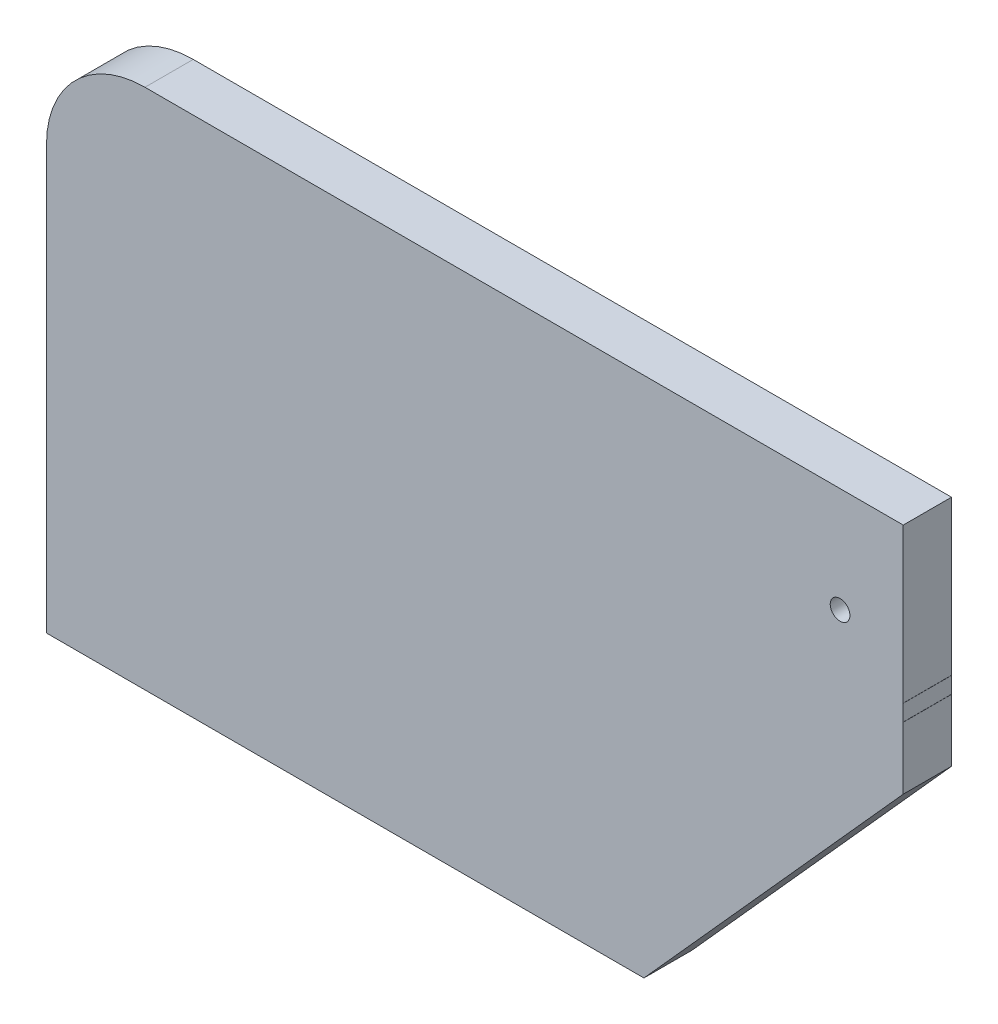
ISO-10303-21;
HEADER;
FILE_DESCRIPTION(('STEP AP214'),'2;1');
FILE_NAME('part.step','',(''),(''),'','','');
FILE_SCHEMA(('AUTOMOTIVE_DESIGN { 1 0 10303 214 1 1 1 1 }'));
ENDSEC;
DATA;
#1=APPLICATION_CONTEXT('core data for automotive mechanical design processes');
#2=APPLICATION_PROTOCOL_DEFINITION('international standard','automotive_design',2000,#1);
#3=PRODUCT_CONTEXT('',#1,'mechanical');
#4=PRODUCT('Part','Part','',(#3));
#5=PRODUCT_RELATED_PRODUCT_CATEGORY('part','',(#4));
#6=PRODUCT_DEFINITION_FORMATION('','',#4);
#7=PRODUCT_DEFINITION_CONTEXT('part definition',#1,'design');
#8=PRODUCT_DEFINITION('design','',#6,#7);
#9=PRODUCT_DEFINITION_SHAPE('','',#8);
#10=(LENGTH_UNIT() NAMED_UNIT(*) SI_UNIT(.MILLI.,.METRE.));
#11=(NAMED_UNIT(*) PLANE_ANGLE_UNIT() SI_UNIT($,.RADIAN.));
#12=(NAMED_UNIT(*) SI_UNIT($,.STERADIAN.) SOLID_ANGLE_UNIT());
#13=UNCERTAINTY_MEASURE_WITH_UNIT(LENGTH_MEASURE(1.E-05),#10,'distance_accuracy_value','');
#14=(GEOMETRIC_REPRESENTATION_CONTEXT(3) GLOBAL_UNCERTAINTY_ASSIGNED_CONTEXT((#13)) GLOBAL_UNIT_ASSIGNED_CONTEXT((#10,
#11,#12)) REPRESENTATION_CONTEXT('',''));
#15=CARTESIAN_POINT('',(0.,0.,0.));
#16=DIRECTION('',(0.,0.,1.));
#17=DIRECTION('',(1.,0.,0.));
#18=AXIS2_PLACEMENT_3D('',#15,#16,#17);
#19=CARTESIAN_POINT('',(17.69985,13.4,1.47));
#20=DIRECTION('',(0.,0.,-1.));
#21=DIRECTION('',(-1.,0.,0.));
#22=AXIS2_PLACEMENT_3D('',#19,#20,#21);
#23=CYLINDRICAL_SURFACE('',#22,0.000150000000000844);
#24=CARTESIAN_POINT('',(17.69985,13.4,0.));
#25=DIRECTION('',(0.,0.,1.));
#26=DIRECTION('',(1.,0.,0.));
#27=AXIS2_PLACEMENT_3D('',#24,#25,#26);
#28=CIRCLE('',#27,0.000150000000000844);
#29=CARTESIAN_POINT('',(17.7,13.4,0.));
#30=VERTEX_POINT('',#29);
#31=CARTESIAN_POINT('',(17.6997,13.4,0.));
#32=VERTEX_POINT('',#31);
#33=EDGE_CURVE('E164',#30,#32,#28,.T.);
#34=ORIENTED_EDGE('',*,*,#33,.F.);
#35=DIRECTION('',(0.,0.,-1.));
#36=VECTOR('',#35,1.);
#37=CARTESIAN_POINT('',(17.7,13.4,1.47));
#38=LINE('',#37,#36);
#39=CARTESIAN_POINT('',(17.7,13.4,1.47));
#40=VERTEX_POINT('',#39);
#41=EDGE_CURVE('E11',#40,#30,#38,.T.);
#42=ORIENTED_EDGE('',*,*,#41,.F.);
#43=CARTESIAN_POINT('',(17.69985,13.4,1.47));
#44=DIRECTION('',(0.,0.,1.));
#45=DIRECTION('',(1.,0.,0.));
#46=AXIS2_PLACEMENT_3D('',#43,#44,#45);
#47=CIRCLE('',#46,0.000150000000000844);
#48=CARTESIAN_POINT('',(17.6997,13.4,1.47));
#49=VERTEX_POINT('',#48);
#50=EDGE_CURVE('E202',#40,#49,#47,.T.);
#51=ORIENTED_EDGE('',*,*,#50,.T.);
#52=DIRECTION('',(0.,0.,-1.));
#53=VECTOR('',#52,1.);
#54=CARTESIAN_POINT('',(17.6997,13.4,1.47));
#55=LINE('',#54,#53);
#56=EDGE_CURVE('E48',#49,#32,#55,.T.);
#57=ORIENTED_EDGE('',*,*,#56,.T.);
#58=EDGE_LOOP('',(#34,#42,#51,#57));
#59=FACE_BOUND('',#58,.T.);
#60=ADVANCED_FACE('F32',(#59),#23,.F.);
#61=CARTESIAN_POINT('',(0.,13.4,1.47));
#62=DIRECTION('',(0.,-1.,0.));
#63=DIRECTION('',(0.,0.,-1.));
#64=AXIS2_PLACEMENT_3D('',#61,#62,#63);
#65=PLANE('',#64);
#66=DIRECTION('',(-1.,0.,0.));
#67=VECTOR('',#66,1.);
#68=CARTESIAN_POINT('',(0.,13.4,0.));
#69=LINE('',#68,#67);
#70=CARTESIAN_POINT('',(18.1997,13.4,0.));
#71=VERTEX_POINT('',#70);
#72=EDGE_CURVE('E166',#71,#30,#69,.T.);
#73=ORIENTED_EDGE('',*,*,#72,.F.);
#74=DIRECTION('',(0.,0.,-1.));
#75=VECTOR('',#74,1.);
#76=CARTESIAN_POINT('',(18.1997,13.4,1.47));
#77=LINE('',#76,#75);
#78=CARTESIAN_POINT('',(18.1997,13.4,1.47));
#79=VERTEX_POINT('',#78);
#80=EDGE_CURVE('E40',#79,#71,#77,.T.);
#81=ORIENTED_EDGE('',*,*,#80,.F.);
#82=DIRECTION('',(-1.,0.,0.));
#83=VECTOR('',#82,1.);
#84=CARTESIAN_POINT('',(0.,13.4,1.47));
#85=LINE('',#84,#83);
#86=EDGE_CURVE('E245',#79,#40,#85,.T.);
#87=ORIENTED_EDGE('',*,*,#86,.T.);
#88=ORIENTED_EDGE('',*,*,#41,.T.);
#89=EDGE_LOOP('',(#73,#81,#87,#88));
#90=FACE_BOUND('',#89,.T.);
#91=ADVANCED_FACE('F232',(#90),#65,.T.);
#92=CARTESIAN_POINT('',(18.19985,13.4,1.47));
#93=DIRECTION('',(0.,0.,-1.));
#94=DIRECTION('',(-1.,0.,0.));
#95=AXIS2_PLACEMENT_3D('',#92,#93,#94);
#96=CYLINDRICAL_SURFACE('',#95,0.000150000000000844);
#97=CARTESIAN_POINT('',(18.19985,13.4,0.));
#98=DIRECTION('',(0.,0.,1.));
#99=DIRECTION('',(1.,0.,0.));
#100=AXIS2_PLACEMENT_3D('',#97,#98,#99);
#101=CIRCLE('',#100,0.000150000000000844);
#102=CARTESIAN_POINT('',(18.2,13.4,0.));
#103=VERTEX_POINT('',#102);
#104=EDGE_CURVE('E169',#103,#71,#101,.T.);
#105=ORIENTED_EDGE('',*,*,#104,.F.);
#106=DIRECTION('',(0.,0.,-1.));
#107=VECTOR('',#106,1.);
#108=CARTESIAN_POINT('',(18.2,13.4,1.47));
#109=LINE('',#108,#107);
#110=CARTESIAN_POINT('',(18.2,13.4,1.47));
#111=VERTEX_POINT('',#110);
#112=EDGE_CURVE('E221',#111,#103,#109,.T.);
#113=ORIENTED_EDGE('',*,*,#112,.F.);
#114=CARTESIAN_POINT('',(18.19985,13.4,1.47));
#115=DIRECTION('',(0.,0.,1.));
#116=DIRECTION('',(1.,0.,0.));
#117=AXIS2_PLACEMENT_3D('',#114,#115,#116);
#118=CIRCLE('',#117,0.000150000000000844);
#119=EDGE_CURVE('E228',#111,#79,#118,.T.);
#120=ORIENTED_EDGE('',*,*,#119,.T.);
#121=ORIENTED_EDGE('',*,*,#80,.T.);
#122=EDGE_LOOP('',(#105,#113,#120,#121));
#123=FACE_BOUND('',#122,.T.);
#124=ADVANCED_FACE('F226',(#123),#96,.F.);
#125=CARTESIAN_POINT('',(0.,13.4,1.47));
#126=DIRECTION('',(0.,-1.,0.));
#127=DIRECTION('',(0.,0.,-1.));
#128=AXIS2_PLACEMENT_3D('',#125,#126,#127);
#129=PLANE('',#128);
#130=DIRECTION('',(-1.,0.,0.));
#131=VECTOR('',#130,1.);
#132=CARTESIAN_POINT('',(0.,13.4,0.));
#133=LINE('',#132,#131);
#134=CARTESIAN_POINT('',(18.5,13.4,0.));
#135=VERTEX_POINT('',#134);
#136=EDGE_CURVE('E172',#135,#103,#133,.T.);
#137=ORIENTED_EDGE('',*,*,#136,.F.);
#138=DIRECTION('',(0.,0.,-1.));
#139=VECTOR('',#138,1.);
#140=CARTESIAN_POINT('',(18.5,13.4,1.47));
#141=LINE('',#140,#139);
#142=CARTESIAN_POINT('',(18.5,13.4,1.47));
#143=VERTEX_POINT('',#142);
#144=EDGE_CURVE('E219',#143,#135,#141,.T.);
#145=ORIENTED_EDGE('',*,*,#144,.F.);
#146=DIRECTION('',(-1.,0.,0.));
#147=VECTOR('',#146,1.);
#148=CARTESIAN_POINT('',(0.,13.4,1.47));
#149=LINE('',#148,#147);
#150=EDGE_CURVE('E244',#143,#111,#149,.T.);
#151=ORIENTED_EDGE('',*,*,#150,.T.);
#152=ORIENTED_EDGE('',*,*,#112,.T.);
#153=EDGE_LOOP('',(#137,#145,#151,#152));
#154=FACE_BOUND('',#153,.T.);
#155=ADVANCED_FACE('F240',(#154),#129,.T.);
#156=CARTESIAN_POINT('',(3.58292456203075,-3.21648909545942,1.47));
#157=DIRECTION('',(-0.744134494477024,0.668029830269146,0.));
#158=DIRECTION('',(-0.668029830269146,-0.744134494477024,0.));
#159=AXIS2_PLACEMENT_3D('',#156,#157,#158);
#160=PLANE('',#159);
#161=DIRECTION('',(0.668029830269146,0.744134494477024,0.));
#162=VECTOR('',#161,1.);
#163=CARTESIAN_POINT('',(3.58292456203075,-3.21648909545942,0.));
#164=LINE('',#163,#162);
#165=CARTESIAN_POINT('',(26.4,22.2,0.));
#166=VERTEX_POINT('',#165);
#167=EDGE_CURVE('E175',#135,#166,#164,.T.);
#168=ORIENTED_EDGE('',*,*,#167,.T.);
#169=DIRECTION('',(0.,0.,-1.));
#170=VECTOR('',#169,1.);
#171=CARTESIAN_POINT('',(26.4,22.2,1.47));
#172=LINE('',#171,#170);
#173=CARTESIAN_POINT('',(26.4,22.2,1.47));
#174=VERTEX_POINT('',#173);
#175=EDGE_CURVE('E216',#174,#166,#172,.T.);
#176=ORIENTED_EDGE('',*,*,#175,.F.);
#177=DIRECTION('',(0.668029830269146,0.744134494477024,0.));
#178=VECTOR('',#177,1.);
#179=CARTESIAN_POINT('',(3.58292456203075,-3.21648909545942,1.47));
#180=LINE('',#179,#178);
#181=EDGE_CURVE('E247',#143,#174,#180,.T.);
#182=ORIENTED_EDGE('',*,*,#181,.F.);
#183=ORIENTED_EDGE('',*,*,#144,.T.);
#184=EDGE_LOOP('',(#168,#176,#182,#183));
#185=FACE_BOUND('',#184,.T.);
#186=ADVANCED_FACE('F296',(#185),#160,.F.);
#187=CARTESIAN_POINT('',(26.4,0.,1.47));
#188=DIRECTION('',(-1.,0.,0.));
#189=DIRECTION('',(0.,0.,1.));
#190=AXIS2_PLACEMENT_3D('',#187,#188,#189);
#191=PLANE('',#190);
#192=DIRECTION('',(0.,1.,0.));
#193=VECTOR('',#192,1.);
#194=CARTESIAN_POINT('',(26.4,0.,0.));
#195=LINE('',#194,#193);
#196=CARTESIAN_POINT('',(26.4,24.0975,0.));
#197=VERTEX_POINT('',#196);
#198=EDGE_CURVE('E177',#166,#197,#195,.T.);
#199=ORIENTED_EDGE('',*,*,#198,.T.);
#200=DIRECTION('',(0.,0.,-1.));
#201=VECTOR('',#200,1.);
#202=CARTESIAN_POINT('',(26.4,24.0975,1.47));
#203=LINE('',#202,#201);
#204=CARTESIAN_POINT('',(26.4,24.0975,1.47));
#205=VERTEX_POINT('',#204);
#206=EDGE_CURVE('E214',#205,#197,#203,.T.);
#207=ORIENTED_EDGE('',*,*,#206,.F.);
#208=DIRECTION('',(0.,1.,0.));
#209=VECTOR('',#208,1.);
#210=CARTESIAN_POINT('',(26.4,0.,1.47));
#211=LINE('',#210,#209);
#212=EDGE_CURVE('E253',#174,#205,#211,.T.);
#213=ORIENTED_EDGE('',*,*,#212,.F.);
#214=ORIENTED_EDGE('',*,*,#175,.T.);
#215=EDGE_LOOP('',(#199,#207,#213,#214));
#216=FACE_BOUND('',#215,.T.);
#217=ADVANCED_FACE('F299',(#216),#191,.F.);
#218=CARTESIAN_POINT('',(26.4,24.1,1.47));
#219=DIRECTION('',(0.,0.,-1.));
#220=DIRECTION('',(-1.,0.,0.));
#221=AXIS2_PLACEMENT_3D('',#218,#219,#220);
#222=CYLINDRICAL_SURFACE('',#221,0.00249999999999903);
#223=CARTESIAN_POINT('',(26.4,24.1,0.));
#224=DIRECTION('',(0.,0.,1.));
#225=DIRECTION('',(1.,0.,0.));
#226=AXIS2_PLACEMENT_3D('',#223,#224,#225);
#227=CIRCLE('',#226,0.00249999999999903);
#228=CARTESIAN_POINT('',(26.4,24.1025,0.));
#229=VERTEX_POINT('',#228);
#230=EDGE_CURVE('E180',#229,#197,#227,.T.);
#231=ORIENTED_EDGE('',*,*,#230,.F.);
#232=DIRECTION('',(0.,0.,-1.));
#233=VECTOR('',#232,1.);
#234=CARTESIAN_POINT('',(26.4,24.1025,1.47));
#235=LINE('',#234,#233);
#236=CARTESIAN_POINT('',(26.4,24.1025,1.47));
#237=VERTEX_POINT('',#236);
#238=EDGE_CURVE('E212',#237,#229,#235,.T.);
#239=ORIENTED_EDGE('',*,*,#238,.F.);
#240=CARTESIAN_POINT('',(26.4,24.1,1.47));
#241=DIRECTION('',(0.,0.,1.));
#242=DIRECTION('',(1.,0.,0.));
#243=AXIS2_PLACEMENT_3D('',#240,#241,#242);
#244=CIRCLE('',#243,0.00249999999999903);
#245=EDGE_CURVE('E255',#237,#205,#244,.T.);
#246=ORIENTED_EDGE('',*,*,#245,.T.);
#247=ORIENTED_EDGE('',*,*,#206,.T.);
#248=EDGE_LOOP('',(#231,#239,#246,#247));
#249=FACE_BOUND('',#248,.T.);
#250=ADVANCED_FACE('F303',(#249),#222,.F.);
#251=CARTESIAN_POINT('',(26.4,0.,1.47));
#252=DIRECTION('',(-1.,0.,0.));
#253=DIRECTION('',(0.,0.,1.));
#254=AXIS2_PLACEMENT_3D('',#251,#252,#253);
#255=PLANE('',#254);
#256=DIRECTION('',(0.,1.,0.));
#257=VECTOR('',#256,1.);
#258=CARTESIAN_POINT('',(26.4,0.,0.));
#259=LINE('',#258,#257);
#260=CARTESIAN_POINT('',(26.4,24.5975,0.));
#261=VERTEX_POINT('',#260);
#262=EDGE_CURVE('E183',#229,#261,#259,.T.);
#263=ORIENTED_EDGE('',*,*,#262,.T.);
#264=DIRECTION('',(0.,0.,-1.));
#265=VECTOR('',#264,1.);
#266=CARTESIAN_POINT('',(26.4,24.5975,1.47));
#267=LINE('',#266,#265);
#268=CARTESIAN_POINT('',(26.4,24.5975,1.47));
#269=VERTEX_POINT('',#268);
#270=EDGE_CURVE('E210',#269,#261,#267,.T.);
#271=ORIENTED_EDGE('',*,*,#270,.F.);
#272=DIRECTION('',(0.,1.,0.));
#273=VECTOR('',#272,1.);
#274=CARTESIAN_POINT('',(26.4,0.,1.47));
#275=LINE('',#274,#273);
#276=EDGE_CURVE('E258',#237,#269,#275,.T.);
#277=ORIENTED_EDGE('',*,*,#276,.F.);
#278=ORIENTED_EDGE('',*,*,#238,.T.);
#279=EDGE_LOOP('',(#263,#271,#277,#278));
#280=FACE_BOUND('',#279,.T.);
#281=ADVANCED_FACE('F307',(#280),#255,.F.);
#282=CARTESIAN_POINT('',(26.4,24.6,1.47));
#283=DIRECTION('',(0.,0.,-1.));
#284=DIRECTION('',(-1.,0.,0.));
#285=AXIS2_PLACEMENT_3D('',#282,#283,#284);
#286=CYLINDRICAL_SURFACE('',#285,0.00249999999999903);
#287=CARTESIAN_POINT('',(26.4,24.6,0.));
#288=DIRECTION('',(0.,0.,1.));
#289=DIRECTION('',(1.,0.,0.));
#290=AXIS2_PLACEMENT_3D('',#287,#288,#289);
#291=CIRCLE('',#290,0.00249999999999903);
#292=CARTESIAN_POINT('',(26.4,24.6025,0.));
#293=VERTEX_POINT('',#292);
#294=EDGE_CURVE('E186',#293,#261,#291,.T.);
#295=ORIENTED_EDGE('',*,*,#294,.F.);
#296=DIRECTION('',(0.,0.,-1.));
#297=VECTOR('',#296,1.);
#298=CARTESIAN_POINT('',(26.4,24.6025,1.47));
#299=LINE('',#298,#297);
#300=CARTESIAN_POINT('',(26.4,24.6025,1.47));
#301=VERTEX_POINT('',#300);
#302=EDGE_CURVE('E208',#301,#293,#299,.T.);
#303=ORIENTED_EDGE('',*,*,#302,.F.);
#304=CARTESIAN_POINT('',(26.4,24.6,1.47));
#305=DIRECTION('',(0.,0.,1.));
#306=DIRECTION('',(1.,0.,0.));
#307=AXIS2_PLACEMENT_3D('',#304,#305,#306);
#308=CIRCLE('',#307,0.00249999999999903);
#309=EDGE_CURVE('E260',#301,#269,#308,.T.);
#310=ORIENTED_EDGE('',*,*,#309,.T.);
#311=ORIENTED_EDGE('',*,*,#270,.T.);
#312=EDGE_LOOP('',(#295,#303,#310,#311));
#313=FACE_BOUND('',#312,.T.);
#314=ADVANCED_FACE('F309',(#313),#286,.F.);
#315=CARTESIAN_POINT('',(26.4,29.3,0.));
#316=VERTEX_POINT('',#315);
#317=EDGE_CURVE('E187',#293,#316,#259,.T.);
#318=ORIENTED_EDGE('',*,*,#317,.T.);
#319=DIRECTION('',(0.,0.,-1.));
#320=VECTOR('',#319,1.);
#321=CARTESIAN_POINT('',(26.4,29.3,1.47));
#322=LINE('',#321,#320);
#323=CARTESIAN_POINT('',(26.4,29.3,1.47));
#324=VERTEX_POINT('',#323);
#325=EDGE_CURVE('E206',#324,#316,#322,.T.);
#326=ORIENTED_EDGE('',*,*,#325,.F.);
#327=EDGE_CURVE('E261',#301,#324,#275,.T.);
#328=ORIENTED_EDGE('',*,*,#327,.F.);
#329=ORIENTED_EDGE('',*,*,#302,.T.);
#330=EDGE_LOOP('',(#318,#326,#328,#329));
#331=FACE_BOUND('',#330,.T.);
#332=ADVANCED_FACE('F269',(#331),#255,.F.);
#333=CARTESIAN_POINT('',(0.,29.3,1.47));
#334=DIRECTION('',(0.,1.,0.));
#335=DIRECTION('',(0.,0.,1.));
#336=AXIS2_PLACEMENT_3D('',#333,#334,#335);
#337=PLANE('',#336);
#338=DIRECTION('',(1.,0.,0.));
#339=VECTOR('',#338,1.);
#340=CARTESIAN_POINT('',(0.,29.3,0.));
#341=LINE('',#340,#339);
#342=CARTESIAN_POINT('',(3.3,29.3,0.));
#343=VERTEX_POINT('',#342);
#344=EDGE_CURVE('E190',#343,#316,#341,.T.);
#345=ORIENTED_EDGE('',*,*,#344,.F.);
#346=DIRECTION('',(0.,0.,-1.));
#347=VECTOR('',#346,1.);
#348=CARTESIAN_POINT('',(3.3,29.3,1.47));
#349=LINE('',#348,#347);
#350=CARTESIAN_POINT('',(3.3,29.3,1.47));
#351=VERTEX_POINT('',#350);
#352=EDGE_CURVE('E153',#351,#343,#349,.T.);
#353=ORIENTED_EDGE('',*,*,#352,.F.);
#354=DIRECTION('',(1.,0.,0.));
#355=VECTOR('',#354,1.);
#356=CARTESIAN_POINT('',(0.,29.3,1.47));
#357=LINE('',#356,#355);
#358=EDGE_CURVE('E143',#351,#324,#357,.T.);
#359=ORIENTED_EDGE('',*,*,#358,.T.);
#360=ORIENTED_EDGE('',*,*,#325,.T.);
#361=EDGE_LOOP('',(#345,#353,#359,#360));
#362=FACE_BOUND('',#361,.T.);
#363=ADVANCED_FACE('F272',(#362),#337,.T.);
#364=CARTESIAN_POINT('',(3.3,26.3,1.47));
#365=DIRECTION('',(0.,0.,-1.));
#366=DIRECTION('',(-1.,0.,0.));
#367=AXIS2_PLACEMENT_3D('',#364,#365,#366);
#368=CYLINDRICAL_SURFACE('',#367,3.);
#369=CARTESIAN_POINT('',(3.3,26.3,0.));
#370=DIRECTION('',(0.,0.,1.));
#371=DIRECTION('',(1.,0.,0.));
#372=AXIS2_PLACEMENT_3D('',#369,#370,#371);
#373=CIRCLE('',#372,3.);
#374=CARTESIAN_POINT('',(0.3,26.3,0.));
#375=VERTEX_POINT('',#374);
#376=EDGE_CURVE('E150',#343,#375,#373,.T.);
#377=ORIENTED_EDGE('',*,*,#376,.T.);
#378=DIRECTION('',(0.,0.,-1.));
#379=VECTOR('',#378,1.);
#380=CARTESIAN_POINT('',(0.3,26.3,1.47));
#381=LINE('',#380,#379);
#382=CARTESIAN_POINT('',(0.3,26.3,1.47));
#383=VERTEX_POINT('',#382);
#384=EDGE_CURVE('E147',#383,#375,#381,.T.);
#385=ORIENTED_EDGE('',*,*,#384,.F.);
#386=CARTESIAN_POINT('',(3.3,26.3,1.47));
#387=DIRECTION('',(0.,0.,1.));
#388=DIRECTION('',(1.,0.,0.));
#389=AXIS2_PLACEMENT_3D('',#386,#387,#388);
#390=CIRCLE('',#389,3.);
#391=EDGE_CURVE('E135',#351,#383,#390,.T.);
#392=ORIENTED_EDGE('',*,*,#391,.F.);
#393=ORIENTED_EDGE('',*,*,#352,.T.);
#394=EDGE_LOOP('',(#377,#385,#392,#393));
#395=FACE_BOUND('',#394,.T.);
#396=ADVANCED_FACE('F148',(#395),#368,.T.);
#397=CARTESIAN_POINT('',(0.3,0.,1.47));
#398=DIRECTION('',(-1.,0.,0.));
#399=DIRECTION('',(0.,0.,1.));
#400=AXIS2_PLACEMENT_3D('',#397,#398,#399);
#401=PLANE('',#400);
#402=DIRECTION('',(0.,1.,0.));
#403=VECTOR('',#402,1.);
#404=CARTESIAN_POINT('',(0.3,0.,0.));
#405=LINE('',#404,#403);
#406=CARTESIAN_POINT('',(0.3,13.4,0.));
#407=VERTEX_POINT('',#406);
#408=EDGE_CURVE('E194',#407,#375,#405,.T.);
#409=ORIENTED_EDGE('',*,*,#408,.F.);
#410=DIRECTION('',(0.,0.,-1.));
#411=VECTOR('',#410,1.);
#412=CARTESIAN_POINT('',(0.3,13.4,1.47));
#413=LINE('',#412,#411);
#414=CARTESIAN_POINT('',(0.3,13.4,1.47));
#415=VERTEX_POINT('',#414);
#416=EDGE_CURVE('E91',#415,#407,#413,.T.);
#417=ORIENTED_EDGE('',*,*,#416,.F.);
#418=DIRECTION('',(0.,1.,0.));
#419=VECTOR('',#418,1.);
#420=CARTESIAN_POINT('',(0.3,0.,1.47));
#421=LINE('',#420,#419);
#422=EDGE_CURVE('E141',#415,#383,#421,.T.);
#423=ORIENTED_EDGE('',*,*,#422,.T.);
#424=ORIENTED_EDGE('',*,*,#384,.T.);
#425=EDGE_LOOP('',(#409,#417,#423,#424));
#426=FACE_BOUND('',#425,.T.);
#427=ADVANCED_FACE('F155',(#426),#401,.T.);
#428=CARTESIAN_POINT('',(0.,13.4,1.47));
#429=DIRECTION('',(0.,-1.,0.));
#430=DIRECTION('',(0.,0.,-1.));
#431=AXIS2_PLACEMENT_3D('',#428,#429,#430);
#432=PLANE('',#431);
#433=DIRECTION('',(-1.,0.,0.));
#434=VECTOR('',#433,1.);
#435=CARTESIAN_POINT('',(0.,13.4,0.));
#436=LINE('',#435,#434);
#437=EDGE_CURVE('E196',#32,#407,#436,.T.);
#438=ORIENTED_EDGE('',*,*,#437,.F.);
#439=ORIENTED_EDGE('',*,*,#56,.F.);
#440=DIRECTION('',(-1.,0.,0.));
#441=VECTOR('',#440,1.);
#442=CARTESIAN_POINT('',(0.,13.4,1.47));
#443=LINE('',#442,#441);
#444=EDGE_CURVE('E156',#49,#415,#443,.T.);
#445=ORIENTED_EDGE('',*,*,#444,.T.);
#446=ORIENTED_EDGE('',*,*,#416,.T.);
#447=EDGE_LOOP('',(#438,#439,#445,#446));
#448=FACE_BOUND('',#447,.T.);
#449=ADVANCED_FACE('F274',(#448),#432,.T.);
#450=CARTESIAN_POINT('',(24.475,26.1,1.47));
#451=DIRECTION('',(0.,0.,-1.));
#452=DIRECTION('',(-1.,0.,0.));
#453=AXIS2_PLACEMENT_3D('',#450,#451,#452);
#454=CYLINDRICAL_SURFACE('',#453,0.300000000000002);
#455=CARTESIAN_POINT('',(24.475,26.1,1.47));
#456=DIRECTION('',(0.,0.,1.));
#457=DIRECTION('',(1.,0.,0.));
#458=AXIS2_PLACEMENT_3D('',#455,#456,#457);
#459=CIRCLE('',#458,0.300000000000002);
#460=CARTESIAN_POINT('',(24.775,26.1,1.47));
#461=VERTEX_POINT('',#460);
#462=EDGE_CURVE('E158',#461,#461,#459,.T.);
#463=ORIENTED_EDGE('',*,*,#462,.T.);
#464=EDGE_LOOP('',(#463));
#465=FACE_BOUND('',#464,.T.);
#466=CARTESIAN_POINT('',(24.475,26.1,0.));
#467=DIRECTION('',(0.,0.,1.));
#468=DIRECTION('',(1.,0.,0.));
#469=AXIS2_PLACEMENT_3D('',#466,#467,#468);
#470=CIRCLE('',#469,0.300000000000002);
#471=CARTESIAN_POINT('',(24.775,26.1,0.));
#472=VERTEX_POINT('',#471);
#473=EDGE_CURVE('E199',#472,#472,#470,.T.);
#474=ORIENTED_EDGE('',*,*,#473,.F.);
#475=EDGE_LOOP('',(#474));
#476=FACE_BOUND('',#475,.T.);
#477=ADVANCED_FACE('F276',(#465,#476),#454,.F.);
#478=CARTESIAN_POINT('',(0.,0.,1.47));
#479=DIRECTION('',(0.,0.,1.));
#480=DIRECTION('',(1.,0.,0.));
#481=AXIS2_PLACEMENT_3D('',#478,#479,#480);
#482=PLANE('',#481);
#483=ORIENTED_EDGE('',*,*,#50,.F.);
#484=ORIENTED_EDGE('',*,*,#86,.F.);
#485=ORIENTED_EDGE('',*,*,#119,.F.);
#486=ORIENTED_EDGE('',*,*,#150,.F.);
#487=ORIENTED_EDGE('',*,*,#181,.T.);
#488=ORIENTED_EDGE('',*,*,#212,.T.);
#489=ORIENTED_EDGE('',*,*,#245,.F.);
#490=ORIENTED_EDGE('',*,*,#276,.T.);
#491=ORIENTED_EDGE('',*,*,#309,.F.);
#492=ORIENTED_EDGE('',*,*,#327,.T.);
#493=ORIENTED_EDGE('',*,*,#358,.F.);
#494=ORIENTED_EDGE('',*,*,#391,.T.);
#495=ORIENTED_EDGE('',*,*,#422,.F.);
#496=ORIENTED_EDGE('',*,*,#444,.F.);
#497=EDGE_LOOP('',(#483,#484,#485,#486,#487,#488,#489,#490,#491,#492,#493,#494,#495,#496));
#498=FACE_BOUND('',#497,.T.);
#499=ORIENTED_EDGE('',*,*,#462,.F.);
#500=EDGE_LOOP('',(#499));
#501=FACE_BOUND('',#500,.T.);
#502=ADVANCED_FACE('F137',(#498,#501),#482,.T.);
#503=CARTESIAN_POINT('',(0.,0.,0.));
#504=DIRECTION('',(0.,0.,1.));
#505=DIRECTION('',(1.,0.,0.));
#506=AXIS2_PLACEMENT_3D('',#503,#504,#505);
#507=PLANE('',#506);
#508=ORIENTED_EDGE('',*,*,#33,.T.);
#509=ORIENTED_EDGE('',*,*,#437,.T.);
#510=ORIENTED_EDGE('',*,*,#408,.T.);
#511=ORIENTED_EDGE('',*,*,#376,.F.);
#512=ORIENTED_EDGE('',*,*,#344,.T.);
#513=ORIENTED_EDGE('',*,*,#317,.F.);
#514=ORIENTED_EDGE('',*,*,#294,.T.);
#515=ORIENTED_EDGE('',*,*,#262,.F.);
#516=ORIENTED_EDGE('',*,*,#230,.T.);
#517=ORIENTED_EDGE('',*,*,#198,.F.);
#518=ORIENTED_EDGE('',*,*,#167,.F.);
#519=ORIENTED_EDGE('',*,*,#136,.T.);
#520=ORIENTED_EDGE('',*,*,#104,.T.);
#521=ORIENTED_EDGE('',*,*,#72,.T.);
#522=EDGE_LOOP('',(#508,#509,#510,#511,#512,#513,#514,#515,#516,#517,#518,#519,#520,#521));
#523=FACE_BOUND('',#522,.T.);
#524=ORIENTED_EDGE('',*,*,#473,.T.);
#525=EDGE_LOOP('',(#524));
#526=FACE_BOUND('',#525,.T.);
#527=ADVANCED_FACE('F234',(#523,#526),#507,.F.);
#528=CLOSED_SHELL('',(#60,#91,#124,#155,#186,#217,#250,#281,#314,#332,#363,#396,#427,#449,#477,
#502,#527));
#529=MANIFOLD_SOLID_BREP('B2',#528);
#530=ADVANCED_BREP_SHAPE_REPRESENTATION('',(#18,#529),#14);
#531=SHAPE_DEFINITION_REPRESENTATION(#9,#530);
ENDSEC;
END-ISO-10303-21;
